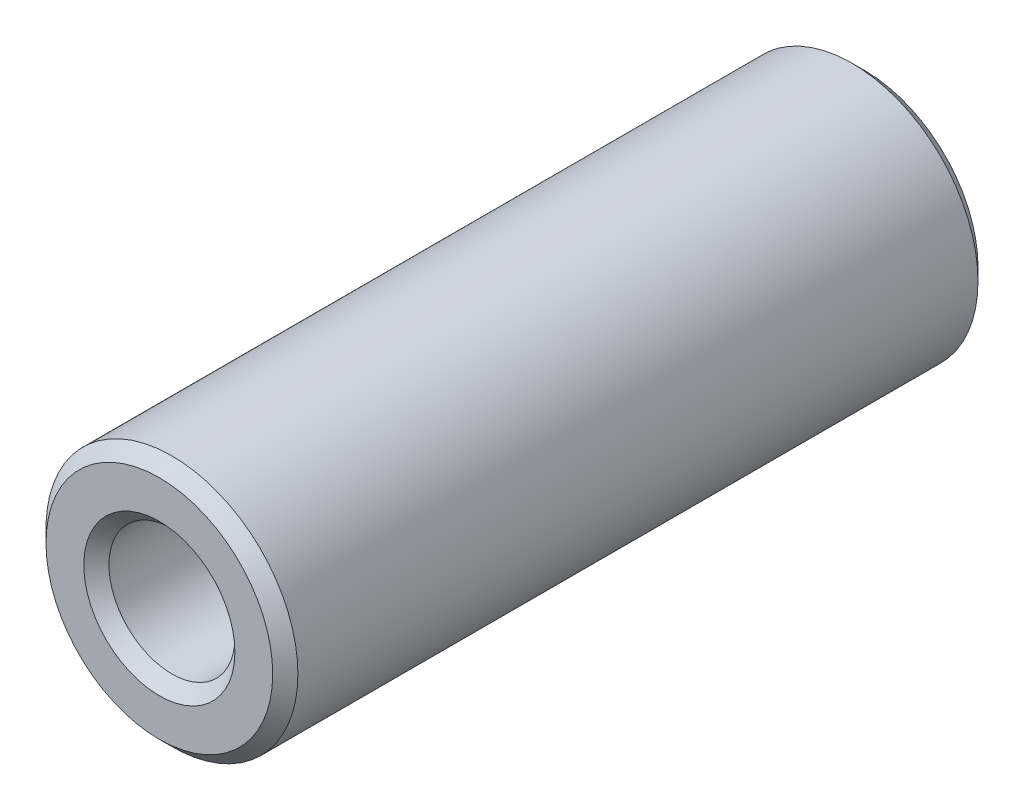
ISO-10303-21;
HEADER;
FILE_DESCRIPTION(('STEP AP214'),'2;1');
FILE_NAME('part.step','',(''),(''),'','','');
FILE_SCHEMA(('AUTOMOTIVE_DESIGN { 1 0 10303 214 1 1 1 1 }'));
ENDSEC;
DATA;
#1=APPLICATION_CONTEXT('core data for automotive mechanical design processes');
#2=APPLICATION_PROTOCOL_DEFINITION('international standard','automotive_design',2000,#1);
#3=PRODUCT_CONTEXT('',#1,'mechanical');
#4=PRODUCT('Part','Part','',(#3));
#5=PRODUCT_RELATED_PRODUCT_CATEGORY('part','',(#4));
#6=PRODUCT_DEFINITION_FORMATION('','',#4);
#7=PRODUCT_DEFINITION_CONTEXT('part definition',#1,'design');
#8=PRODUCT_DEFINITION('design','',#6,#7);
#9=PRODUCT_DEFINITION_SHAPE('','',#8);
#10=(LENGTH_UNIT() NAMED_UNIT(*) SI_UNIT(.MILLI.,.METRE.));
#11=(NAMED_UNIT(*) PLANE_ANGLE_UNIT() SI_UNIT($,.RADIAN.));
#12=(NAMED_UNIT(*) SI_UNIT($,.STERADIAN.) SOLID_ANGLE_UNIT());
#13=UNCERTAINTY_MEASURE_WITH_UNIT(LENGTH_MEASURE(1.E-05),#10,'distance_accuracy_value','');
#14=(GEOMETRIC_REPRESENTATION_CONTEXT(3) GLOBAL_UNCERTAINTY_ASSIGNED_CONTEXT((#13)) GLOBAL_UNIT_ASSIGNED_CONTEXT((#10,
#11,#12)) REPRESENTATION_CONTEXT('',''));
#15=CARTESIAN_POINT('',(0.,0.,0.));
#16=DIRECTION('',(0.,0.,1.));
#17=DIRECTION('',(1.,0.,0.));
#18=AXIS2_PLACEMENT_3D('',#15,#16,#17);
#19=CARTESIAN_POINT('',(0.,0.,14.));
#20=DIRECTION('',(0.,0.,1.));
#21=DIRECTION('',(1.,0.,0.));
#22=AXIS2_PLACEMENT_3D('',#19,#20,#21);
#23=PLANE('',#22);
#24=CARTESIAN_POINT('',(0.,0.,14.));
#25=DIRECTION('',(0.,0.,1.));
#26=DIRECTION('',(1.,0.,0.));
#27=AXIS2_PLACEMENT_3D('',#24,#25,#26);
#28=CIRCLE('',#27,3.);
#29=CARTESIAN_POINT('',(3.,0.,14.));
#30=VERTEX_POINT('',#29);
#31=EDGE_CURVE('E52',#30,#30,#28,.F.);
#32=ORIENTED_EDGE('',*,*,#31,.T.);
#33=EDGE_LOOP('',(#32));
#34=FACE_BOUND('',#33,.T.);
#35=CARTESIAN_POINT('',(0.,0.,14.));
#36=DIRECTION('',(0.,0.,1.));
#37=DIRECTION('',(1.,0.,0.));
#38=AXIS2_PLACEMENT_3D('',#35,#36,#37);
#39=CIRCLE('',#38,4.49999999999999);
#40=CARTESIAN_POINT('',(4.49999999999999,0.,14.));
#41=VERTEX_POINT('',#40);
#42=EDGE_CURVE('E60',#41,#41,#39,.T.);
#43=ORIENTED_EDGE('',*,*,#42,.T.);
#44=EDGE_LOOP('',(#43));
#45=FACE_BOUND('',#44,.T.);
#46=ADVANCED_FACE('F41',(#34,#45),#23,.T.);
#47=CARTESIAN_POINT('',(0.,0.,-14.));
#48=DIRECTION('',(0.,0.,1.));
#49=DIRECTION('',(1.,0.,0.));
#50=AXIS2_PLACEMENT_3D('',#47,#48,#49);
#51=PLANE('',#50);
#52=CARTESIAN_POINT('',(0.,0.,-14.));
#53=DIRECTION('',(0.,0.,1.));
#54=DIRECTION('',(1.,0.,0.));
#55=AXIS2_PLACEMENT_3D('',#52,#53,#54);
#56=CIRCLE('',#55,3.);
#57=CARTESIAN_POINT('',(3.,0.,-14.));
#58=VERTEX_POINT('',#57);
#59=EDGE_CURVE('E68',#58,#58,#56,.T.);
#60=ORIENTED_EDGE('',*,*,#59,.T.);
#61=EDGE_LOOP('',(#60));
#62=FACE_BOUND('',#61,.T.);
#63=CARTESIAN_POINT('',(0.,0.,-14.));
#64=DIRECTION('',(0.,0.,1.));
#65=DIRECTION('',(1.,0.,0.));
#66=AXIS2_PLACEMENT_3D('',#63,#64,#65);
#67=CIRCLE('',#66,4.5);
#68=CARTESIAN_POINT('',(4.5,0.,-14.));
#69=VERTEX_POINT('',#68);
#70=EDGE_CURVE('E72',#69,#69,#67,.F.);
#71=ORIENTED_EDGE('',*,*,#70,.T.);
#72=EDGE_LOOP('',(#71));
#73=FACE_BOUND('',#72,.T.);
#74=ADVANCED_FACE('F73',(#62,#73),#51,.F.);
#75=CARTESIAN_POINT('',(0.,0.,14.));
#76=DIRECTION('',(0.,0.,-1.));
#77=DIRECTION('',(-1.,0.,0.));
#78=AXIS2_PLACEMENT_3D('',#75,#76,#77);
#79=CYLINDRICAL_SURFACE('',#78,5.);
#80=CARTESIAN_POINT('',(0.,0.,-13.5));
#81=DIRECTION('',(0.,0.,1.));
#82=DIRECTION('',(1.,0.,0.));
#83=AXIS2_PLACEMENT_3D('',#80,#81,#82);
#84=CIRCLE('',#83,5.);
#85=CARTESIAN_POINT('',(5.,0.,-13.5));
#86=VERTEX_POINT('',#85);
#87=EDGE_CURVE('E10',#86,#86,#84,.T.);
#88=ORIENTED_EDGE('',*,*,#87,.T.);
#89=EDGE_LOOP('',(#88));
#90=FACE_BOUND('',#89,.T.);
#91=CARTESIAN_POINT('',(0.,0.,13.5));
#92=DIRECTION('',(0.,0.,1.));
#93=DIRECTION('',(1.,0.,0.));
#94=AXIS2_PLACEMENT_3D('',#91,#92,#93);
#95=CIRCLE('',#94,5.);
#96=CARTESIAN_POINT('',(5.,0.,13.5));
#97=VERTEX_POINT('',#96);
#98=EDGE_CURVE('E47',#97,#97,#95,.F.);
#99=ORIENTED_EDGE('',*,*,#98,.T.);
#100=EDGE_LOOP('',(#99));
#101=FACE_BOUND('',#100,.T.);
#102=ADVANCED_FACE('F96',(#90,#101),#79,.T.);
#103=CARTESIAN_POINT('',(0.,0.,14.));
#104=DIRECTION('',(0.,0.,-1.));
#105=DIRECTION('',(-1.,0.,0.));
#106=AXIS2_PLACEMENT_3D('',#103,#104,#105);
#107=CYLINDRICAL_SURFACE('',#106,2.5);
#108=CARTESIAN_POINT('',(0.,0.,-13.5));
#109=DIRECTION('',(0.,0.,1.));
#110=DIRECTION('',(1.,0.,0.));
#111=AXIS2_PLACEMENT_3D('',#108,#109,#110);
#112=CIRCLE('',#111,2.5);
#113=CARTESIAN_POINT('',(2.5,0.,-13.5));
#114=VERTEX_POINT('',#113);
#115=EDGE_CURVE('E65',#114,#114,#112,.F.);
#116=ORIENTED_EDGE('',*,*,#115,.T.);
#117=EDGE_LOOP('',(#116));
#118=FACE_BOUND('',#117,.T.);
#119=CARTESIAN_POINT('',(0.,0.,13.5));
#120=DIRECTION('',(0.,0.,1.));
#121=DIRECTION('',(1.,0.,0.));
#122=AXIS2_PLACEMENT_3D('',#119,#120,#121);
#123=CIRCLE('',#122,2.5);
#124=CARTESIAN_POINT('',(2.5,0.,13.5));
#125=VERTEX_POINT('',#124);
#126=EDGE_CURVE('E64',#125,#125,#123,.T.);
#127=ORIENTED_EDGE('',*,*,#126,.T.);
#128=EDGE_LOOP('',(#127));
#129=FACE_BOUND('',#128,.T.);
#130=ADVANCED_FACE('F101',(#118,#129),#107,.F.);
#131=CARTESIAN_POINT('',(0.,0.,-14.));
#132=DIRECTION('',(0.,0.,-1.));
#133=DIRECTION('',(-1.,0.,0.));
#134=AXIS2_PLACEMENT_3D('',#131,#132,#133);
#135=CONICAL_SURFACE('',#134,3.,0.785398163397444);
#136=ORIENTED_EDGE('',*,*,#115,.F.);
#137=EDGE_LOOP('',(#136));
#138=FACE_BOUND('',#137,.T.);
#139=ORIENTED_EDGE('',*,*,#59,.F.);
#140=EDGE_LOOP('',(#139));
#141=FACE_BOUND('',#140,.T.);
#142=ADVANCED_FACE('F88',(#138,#141),#135,.F.);
#143=CARTESIAN_POINT('',(0.,0.,13.5));
#144=DIRECTION('',(0.,0.,1.));
#145=DIRECTION('',(1.,0.,0.));
#146=AXIS2_PLACEMENT_3D('',#143,#144,#145);
#147=CONICAL_SURFACE('',#146,2.5,0.78539816339745);
#148=ORIENTED_EDGE('',*,*,#31,.F.);
#149=EDGE_LOOP('',(#148));
#150=FACE_BOUND('',#149,.T.);
#151=ORIENTED_EDGE('',*,*,#126,.F.);
#152=EDGE_LOOP('',(#151));
#153=FACE_BOUND('',#152,.T.);
#154=ADVANCED_FACE('F79',(#150,#153),#147,.F.);
#155=CARTESIAN_POINT('',(0.,0.,-13.5));
#156=DIRECTION('',(0.,0.,1.));
#157=DIRECTION('',(1.,0.,0.));
#158=AXIS2_PLACEMENT_3D('',#155,#156,#157);
#159=CONICAL_SURFACE('',#158,5.,0.785398163397451);
#160=ORIENTED_EDGE('',*,*,#70,.F.);
#161=EDGE_LOOP('',(#160));
#162=FACE_BOUND('',#161,.T.);
#163=ORIENTED_EDGE('',*,*,#87,.F.);
#164=EDGE_LOOP('',(#163));
#165=FACE_BOUND('',#164,.T.);
#166=ADVANCED_FACE('F80',(#162,#165),#159,.T.);
#167=CARTESIAN_POINT('',(0.,0.,14.));
#168=DIRECTION('',(0.,0.,-1.));
#169=DIRECTION('',(-1.,0.,0.));
#170=AXIS2_PLACEMENT_3D('',#167,#168,#169);
#171=CONICAL_SURFACE('',#170,4.49999999999999,0.785398163397449);
#172=ORIENTED_EDGE('',*,*,#98,.F.);
#173=EDGE_LOOP('',(#172));
#174=FACE_BOUND('',#173,.T.);
#175=ORIENTED_EDGE('',*,*,#42,.F.);
#176=EDGE_LOOP('',(#175));
#177=FACE_BOUND('',#176,.T.);
#178=ADVANCED_FACE('F42',(#174,#177),#171,.T.);
#179=CLOSED_SHELL('',(#46,#74,#102,#130,#142,#154,#166,#178));
#180=MANIFOLD_SOLID_BREP('B2',#179);
#181=ADVANCED_BREP_SHAPE_REPRESENTATION('',(#18,#180),#14);
#182=SHAPE_DEFINITION_REPRESENTATION(#9,#181);
ENDSEC;
END-ISO-10303-21;
